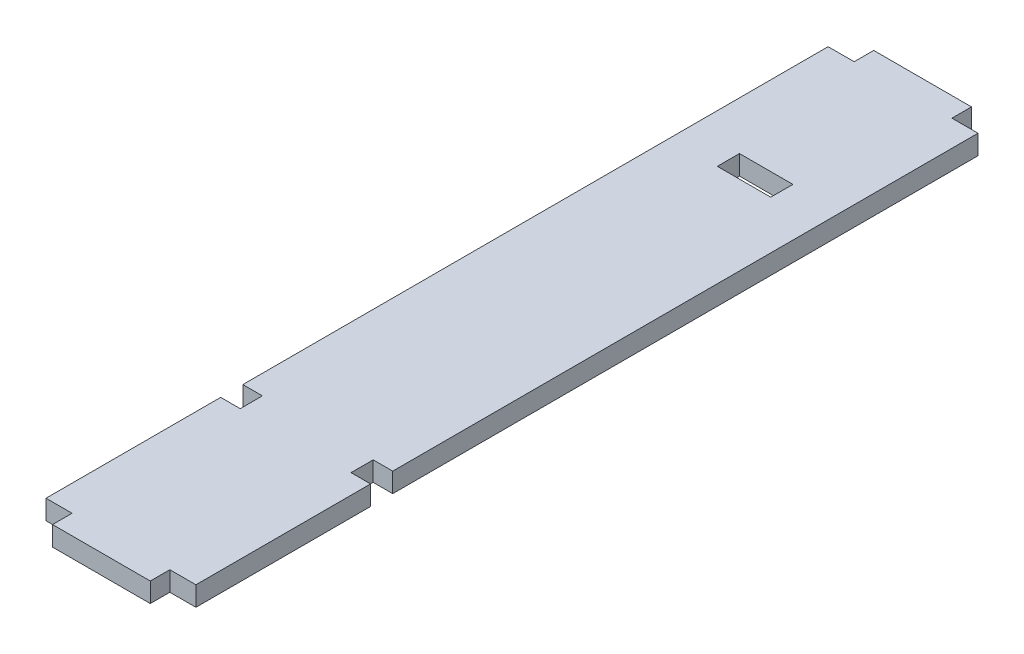
ISO-10303-21;
HEADER;
FILE_DESCRIPTION(('STEP AP214'),'2;1');
FILE_NAME('part.step','',(''),(''),'','','');
FILE_SCHEMA(('AUTOMOTIVE_DESIGN { 1 0 10303 214 1 1 1 1 }'));
ENDSEC;
DATA;
#1=APPLICATION_CONTEXT('core data for automotive mechanical design processes');
#2=APPLICATION_PROTOCOL_DEFINITION('international standard','automotive_design',2000,#1);
#3=PRODUCT_CONTEXT('',#1,'mechanical');
#4=PRODUCT('Part','Part','',(#3));
#5=PRODUCT_RELATED_PRODUCT_CATEGORY('part','',(#4));
#6=PRODUCT_DEFINITION_FORMATION('','',#4);
#7=PRODUCT_DEFINITION_CONTEXT('part definition',#1,'design');
#8=PRODUCT_DEFINITION('design','',#6,#7);
#9=PRODUCT_DEFINITION_SHAPE('','',#8);
#10=(LENGTH_UNIT() NAMED_UNIT(*) SI_UNIT(.MILLI.,.METRE.));
#11=(NAMED_UNIT(*) PLANE_ANGLE_UNIT() SI_UNIT($,.RADIAN.));
#12=(NAMED_UNIT(*) SI_UNIT($,.STERADIAN.) SOLID_ANGLE_UNIT());
#13=UNCERTAINTY_MEASURE_WITH_UNIT(LENGTH_MEASURE(1.E-05),#10,'distance_accuracy_value','');
#14=(GEOMETRIC_REPRESENTATION_CONTEXT(3) GLOBAL_UNCERTAINTY_ASSIGNED_CONTEXT((#13)) GLOBAL_UNIT_ASSIGNED_CONTEXT((#10,
#11,#12)) REPRESENTATION_CONTEXT('',''));
#15=CARTESIAN_POINT('',(0.,0.,0.));
#16=DIRECTION('',(0.,0.,1.));
#17=DIRECTION('',(1.,0.,0.));
#18=AXIS2_PLACEMENT_3D('',#15,#16,#17);
#19=CARTESIAN_POINT('',(0.,1.5,0.));
#20=DIRECTION('',(0.,-1.,0.));
#21=DIRECTION('',(0.,0.,-1.));
#22=AXIS2_PLACEMENT_3D('',#19,#20,#21);
#23=PLANE('',#22);
#24=DIRECTION('',(0.,0.,-1.));
#25=VECTOR('',#24,1.);
#26=CARTESIAN_POINT('',(5.75,1.5,14.9000000000339));
#27=LINE('',#26,#25);
#28=CARTESIAN_POINT('',(5.75,1.5,14.9000000000339));
#29=VERTEX_POINT('',#28);
#30=CARTESIAN_POINT('',(5.75,1.5,-30.));
#31=VERTEX_POINT('',#30);
#32=EDGE_CURVE('E230',#29,#31,#27,.T.);
#33=ORIENTED_EDGE('',*,*,#32,.T.);
#34=DIRECTION('',(-1.,0.,0.));
#35=VECTOR('',#34,1.);
#36=CARTESIAN_POINT('',(3.75,1.5,-30.));
#37=LINE('',#36,#35);
#38=CARTESIAN_POINT('',(3.75,1.5,-30.));
#39=VERTEX_POINT('',#38);
#40=EDGE_CURVE('E233',#31,#39,#37,.T.);
#41=ORIENTED_EDGE('',*,*,#40,.T.);
#42=DIRECTION('',(0.,0.,-1.));
#43=VECTOR('',#42,1.);
#44=CARTESIAN_POINT('',(3.75,1.5,-30.));
#45=LINE('',#44,#43);
#46=CARTESIAN_POINT('',(3.75,1.5,-31.5));
#47=VERTEX_POINT('',#46);
#48=EDGE_CURVE('E236',#39,#47,#45,.T.);
#49=ORIENTED_EDGE('',*,*,#48,.T.);
#50=DIRECTION('',(-1.,0.,0.));
#51=VECTOR('',#50,1.);
#52=CARTESIAN_POINT('',(3.75,1.5,-31.5));
#53=LINE('',#52,#51);
#54=CARTESIAN_POINT('',(-3.75,1.5,-31.5));
#55=VERTEX_POINT('',#54);
#56=EDGE_CURVE('E238',#47,#55,#53,.T.);
#57=ORIENTED_EDGE('',*,*,#56,.T.);
#58=DIRECTION('',(0.,0.,1.));
#59=VECTOR('',#58,1.);
#60=CARTESIAN_POINT('',(-3.75,1.5,-30.));
#61=LINE('',#60,#59);
#62=CARTESIAN_POINT('',(-3.75,1.5,-30.));
#63=VERTEX_POINT('',#62);
#64=EDGE_CURVE('E240',#55,#63,#61,.T.);
#65=ORIENTED_EDGE('',*,*,#64,.T.);
#66=DIRECTION('',(-1.,0.,0.));
#67=VECTOR('',#66,1.);
#68=CARTESIAN_POINT('',(-5.75,1.5,-30.));
#69=LINE('',#68,#67);
#70=CARTESIAN_POINT('',(-5.75,1.5,-30.));
#71=VERTEX_POINT('',#70);
#72=EDGE_CURVE('E242',#63,#71,#69,.T.);
#73=ORIENTED_EDGE('',*,*,#72,.T.);
#74=DIRECTION('',(0.,0.,1.));
#75=VECTOR('',#74,1.);
#76=CARTESIAN_POINT('',(-5.75,1.5,14.9000000000339));
#77=LINE('',#76,#75);
#78=CARTESIAN_POINT('',(-5.75,1.5,14.9000000000339));
#79=VERTEX_POINT('',#78);
#80=EDGE_CURVE('E244',#71,#79,#77,.T.);
#81=ORIENTED_EDGE('',*,*,#80,.T.);
#82=DIRECTION('',(1.,0.,0.));
#83=VECTOR('',#82,1.);
#84=CARTESIAN_POINT('',(-5.75,1.5,14.9000000000339));
#85=LINE('',#84,#83);
#86=CARTESIAN_POINT('',(-4.25,1.5,14.9000000000339));
#87=VERTEX_POINT('',#86);
#88=EDGE_CURVE('E246',#79,#87,#85,.T.);
#89=ORIENTED_EDGE('',*,*,#88,.T.);
#90=DIRECTION('',(0.,0.,1.));
#91=VECTOR('',#90,1.);
#92=CARTESIAN_POINT('',(-4.25,1.5,14.9000000000339));
#93=LINE('',#92,#91);
#94=CARTESIAN_POINT('',(-4.25,1.5,16.6000000000343));
#95=VERTEX_POINT('',#94);
#96=EDGE_CURVE('E248',#87,#95,#93,.T.);
#97=ORIENTED_EDGE('',*,*,#96,.T.);
#98=DIRECTION('',(-1.,0.,0.));
#99=VECTOR('',#98,1.);
#100=CARTESIAN_POINT('',(-5.75,1.5,16.6000000000343));
#101=LINE('',#100,#99);
#102=CARTESIAN_POINT('',(-5.75,1.5,16.6000000000343));
#103=VERTEX_POINT('',#102);
#104=EDGE_CURVE('E250',#95,#103,#101,.T.);
#105=ORIENTED_EDGE('',*,*,#104,.T.);
#106=DIRECTION('',(0.,0.,1.));
#107=VECTOR('',#106,1.);
#108=CARTESIAN_POINT('',(-5.75,1.5,30.));
#109=LINE('',#108,#107);
#110=CARTESIAN_POINT('',(-5.75,1.5,30.));
#111=VERTEX_POINT('',#110);
#112=EDGE_CURVE('E252',#103,#111,#109,.T.);
#113=ORIENTED_EDGE('',*,*,#112,.T.);
#114=DIRECTION('',(1.,0.,0.));
#115=VECTOR('',#114,1.);
#116=CARTESIAN_POINT('',(-5.75,1.5,30.));
#117=LINE('',#116,#115);
#118=CARTESIAN_POINT('',(-3.75,1.5,30.));
#119=VERTEX_POINT('',#118);
#120=EDGE_CURVE('E254',#111,#119,#117,.T.);
#121=ORIENTED_EDGE('',*,*,#120,.T.);
#122=DIRECTION('',(0.,0.,1.));
#123=VECTOR('',#122,1.);
#124=CARTESIAN_POINT('',(-3.75,1.5,30.));
#125=LINE('',#124,#123);
#126=CARTESIAN_POINT('',(-3.75,1.5,31.5));
#127=VERTEX_POINT('',#126);
#128=EDGE_CURVE('E256',#119,#127,#125,.T.);
#129=ORIENTED_EDGE('',*,*,#128,.T.);
#130=DIRECTION('',(1.,0.,0.));
#131=VECTOR('',#130,1.);
#132=CARTESIAN_POINT('',(-3.75,1.5,31.5));
#133=LINE('',#132,#131);
#134=CARTESIAN_POINT('',(3.75,1.5,31.5));
#135=VERTEX_POINT('',#134);
#136=EDGE_CURVE('E258',#127,#135,#133,.T.);
#137=ORIENTED_EDGE('',*,*,#136,.T.);
#138=DIRECTION('',(0.,0.,-1.));
#139=VECTOR('',#138,1.);
#140=CARTESIAN_POINT('',(3.75,1.5,30.));
#141=LINE('',#140,#139);
#142=CARTESIAN_POINT('',(3.75,1.5,30.));
#143=VERTEX_POINT('',#142);
#144=EDGE_CURVE('E260',#135,#143,#141,.T.);
#145=ORIENTED_EDGE('',*,*,#144,.T.);
#146=DIRECTION('',(1.,0.,0.));
#147=VECTOR('',#146,1.);
#148=CARTESIAN_POINT('',(3.75,1.5,30.));
#149=LINE('',#148,#147);
#150=CARTESIAN_POINT('',(5.75,1.5,30.));
#151=VERTEX_POINT('',#150);
#152=EDGE_CURVE('E262',#143,#151,#149,.T.);
#153=ORIENTED_EDGE('',*,*,#152,.T.);
#154=DIRECTION('',(0.,0.,-1.));
#155=VECTOR('',#154,1.);
#156=CARTESIAN_POINT('',(5.75,1.5,30.));
#157=LINE('',#156,#155);
#158=CARTESIAN_POINT('',(5.75,1.5,16.6000000000343));
#159=VERTEX_POINT('',#158);
#160=EDGE_CURVE('E264',#151,#159,#157,.T.);
#161=ORIENTED_EDGE('',*,*,#160,.T.);
#162=DIRECTION('',(-1.,0.,0.));
#163=VECTOR('',#162,1.);
#164=CARTESIAN_POINT('',(5.75,1.5,16.6000000000343));
#165=LINE('',#164,#163);
#166=CARTESIAN_POINT('',(4.25,1.5,16.6000000000343));
#167=VERTEX_POINT('',#166);
#168=EDGE_CURVE('E266',#159,#167,#165,.T.);
#169=ORIENTED_EDGE('',*,*,#168,.T.);
#170=DIRECTION('',(0.,0.,-1.));
#171=VECTOR('',#170,1.);
#172=CARTESIAN_POINT('',(4.25,1.5,16.6000000000343));
#173=LINE('',#172,#171);
#174=CARTESIAN_POINT('',(4.25,1.5,14.9000000000339));
#175=VERTEX_POINT('',#174);
#176=EDGE_CURVE('E268',#167,#175,#173,.T.);
#177=ORIENTED_EDGE('',*,*,#176,.T.);
#178=DIRECTION('',(1.,0.,0.));
#179=VECTOR('',#178,1.);
#180=CARTESIAN_POINT('',(5.75,1.5,14.9000000000339));
#181=LINE('',#180,#179);
#182=EDGE_CURVE('E270',#175,#29,#181,.T.);
#183=ORIENTED_EDGE('',*,*,#182,.T.);
#184=EDGE_LOOP('',(#33,#41,#49,#57,#65,#73,#81,#89,#97,#105,#113,#121,#129,#137,#145,#153,#161,
#169,#177,#183));
#185=FACE_BOUND('',#184,.T.);
#186=DIRECTION('',(0.,0.,-1.));
#187=VECTOR('',#186,1.);
#188=CARTESIAN_POINT('',(2.05,1.5,-17.8));
#189=LINE('',#188,#187);
#190=CARTESIAN_POINT('',(2.05,1.5,-17.8));
#191=VERTEX_POINT('',#190);
#192=CARTESIAN_POINT('',(2.05,1.5,-19.5));
#193=VERTEX_POINT('',#192);
#194=EDGE_CURVE('E194',#191,#193,#189,.T.);
#195=ORIENTED_EDGE('',*,*,#194,.F.);
#196=DIRECTION('',(1.,0.,0.));
#197=VECTOR('',#196,1.);
#198=CARTESIAN_POINT('',(-2.05,1.5,-17.8));
#199=LINE('',#198,#197);
#200=CARTESIAN_POINT('',(-2.05,1.5,-17.8));
#201=VERTEX_POINT('',#200);
#202=EDGE_CURVE('E216',#201,#191,#199,.T.);
#203=ORIENTED_EDGE('',*,*,#202,.F.);
#204=DIRECTION('',(0.,0.,1.));
#205=VECTOR('',#204,1.);
#206=CARTESIAN_POINT('',(-2.05,1.5,-17.8));
#207=LINE('',#206,#205);
#208=CARTESIAN_POINT('',(-2.05,1.5,-19.5));
#209=VERTEX_POINT('',#208);
#210=EDGE_CURVE('E214',#209,#201,#207,.T.);
#211=ORIENTED_EDGE('',*,*,#210,.F.);
#212=DIRECTION('',(-1.,0.,0.));
#213=VECTOR('',#212,1.);
#214=CARTESIAN_POINT('',(-2.05,1.5,-19.5));
#215=LINE('',#214,#213);
#216=EDGE_CURVE('E202',#193,#209,#215,.T.);
#217=ORIENTED_EDGE('',*,*,#216,.F.);
#218=EDGE_LOOP('',(#195,#203,#211,#217));
#219=FACE_BOUND('',#218,.T.);
#220=ADVANCED_FACE('F33',(#185,#219),#23,.F.);
#221=CARTESIAN_POINT('',(0.,0.,0.));
#222=DIRECTION('',(0.,-1.,0.));
#223=DIRECTION('',(0.,0.,-1.));
#224=AXIS2_PLACEMENT_3D('',#221,#222,#223);
#225=PLANE('',#224);
#226=DIRECTION('',(0.,0.,-1.));
#227=VECTOR('',#226,1.);
#228=CARTESIAN_POINT('',(5.75,0.,14.9000000000339));
#229=LINE('',#228,#227);
#230=CARTESIAN_POINT('',(5.75,0.,14.9000000000339));
#231=VERTEX_POINT('',#230);
#232=CARTESIAN_POINT('',(5.75,0.,-30.));
#233=VERTEX_POINT('',#232);
#234=EDGE_CURVE('E210',#231,#233,#229,.T.);
#235=ORIENTED_EDGE('',*,*,#234,.F.);
#236=DIRECTION('',(1.,0.,0.));
#237=VECTOR('',#236,1.);
#238=CARTESIAN_POINT('',(5.75,0.,14.9000000000339));
#239=LINE('',#238,#237);
#240=CARTESIAN_POINT('',(4.25,0.,14.9000000000339));
#241=VERTEX_POINT('',#240);
#242=EDGE_CURVE('E234',#241,#231,#239,.T.);
#243=ORIENTED_EDGE('',*,*,#242,.F.);
#244=DIRECTION('',(0.,0.,-1.));
#245=VECTOR('',#244,1.);
#246=CARTESIAN_POINT('',(4.25,0.,16.6000000000343));
#247=LINE('',#246,#245);
#248=CARTESIAN_POINT('',(4.25,0.,16.6000000000343));
#249=VERTEX_POINT('',#248);
#250=EDGE_CURVE('E309',#249,#241,#247,.T.);
#251=ORIENTED_EDGE('',*,*,#250,.F.);
#252=DIRECTION('',(-1.,0.,0.));
#253=VECTOR('',#252,1.);
#254=CARTESIAN_POINT('',(5.75,0.,16.6000000000343));
#255=LINE('',#254,#253);
#256=CARTESIAN_POINT('',(5.75,0.,16.6000000000343));
#257=VERTEX_POINT('',#256);
#258=EDGE_CURVE('E307',#257,#249,#255,.T.);
#259=ORIENTED_EDGE('',*,*,#258,.F.);
#260=DIRECTION('',(0.,0.,-1.));
#261=VECTOR('',#260,1.);
#262=CARTESIAN_POINT('',(5.75,0.,30.));
#263=LINE('',#262,#261);
#264=CARTESIAN_POINT('',(5.75,0.,30.));
#265=VERTEX_POINT('',#264);
#266=EDGE_CURVE('E305',#265,#257,#263,.T.);
#267=ORIENTED_EDGE('',*,*,#266,.F.);
#268=DIRECTION('',(1.,0.,0.));
#269=VECTOR('',#268,1.);
#270=CARTESIAN_POINT('',(3.75,0.,30.));
#271=LINE('',#270,#269);
#272=CARTESIAN_POINT('',(3.75,0.,30.));
#273=VERTEX_POINT('',#272);
#274=EDGE_CURVE('E303',#273,#265,#271,.T.);
#275=ORIENTED_EDGE('',*,*,#274,.F.);
#276=DIRECTION('',(0.,0.,-1.));
#277=VECTOR('',#276,1.);
#278=CARTESIAN_POINT('',(3.75,0.,30.));
#279=LINE('',#278,#277);
#280=CARTESIAN_POINT('',(3.75,0.,31.5));
#281=VERTEX_POINT('',#280);
#282=EDGE_CURVE('E301',#281,#273,#279,.T.);
#283=ORIENTED_EDGE('',*,*,#282,.F.);
#284=DIRECTION('',(1.,0.,0.));
#285=VECTOR('',#284,1.);
#286=CARTESIAN_POINT('',(-3.75,0.,31.5));
#287=LINE('',#286,#285);
#288=CARTESIAN_POINT('',(-3.75,0.,31.5));
#289=VERTEX_POINT('',#288);
#290=EDGE_CURVE('E299',#289,#281,#287,.T.);
#291=ORIENTED_EDGE('',*,*,#290,.F.);
#292=DIRECTION('',(0.,0.,1.));
#293=VECTOR('',#292,1.);
#294=CARTESIAN_POINT('',(-3.75,0.,30.));
#295=LINE('',#294,#293);
#296=CARTESIAN_POINT('',(-3.75,0.,30.));
#297=VERTEX_POINT('',#296);
#298=EDGE_CURVE('E297',#297,#289,#295,.T.);
#299=ORIENTED_EDGE('',*,*,#298,.F.);
#300=DIRECTION('',(1.,0.,0.));
#301=VECTOR('',#300,1.);
#302=CARTESIAN_POINT('',(-5.75,0.,30.));
#303=LINE('',#302,#301);
#304=CARTESIAN_POINT('',(-5.75,0.,30.));
#305=VERTEX_POINT('',#304);
#306=EDGE_CURVE('E295',#305,#297,#303,.T.);
#307=ORIENTED_EDGE('',*,*,#306,.F.);
#308=DIRECTION('',(0.,0.,1.));
#309=VECTOR('',#308,1.);
#310=CARTESIAN_POINT('',(-5.75,0.,30.));
#311=LINE('',#310,#309);
#312=CARTESIAN_POINT('',(-5.75,0.,16.6000000000343));
#313=VERTEX_POINT('',#312);
#314=EDGE_CURVE('E293',#313,#305,#311,.T.);
#315=ORIENTED_EDGE('',*,*,#314,.F.);
#316=DIRECTION('',(-1.,0.,0.));
#317=VECTOR('',#316,1.);
#318=CARTESIAN_POINT('',(-5.75,0.,16.6000000000343));
#319=LINE('',#318,#317);
#320=CARTESIAN_POINT('',(-4.25,0.,16.6000000000343));
#321=VERTEX_POINT('',#320);
#322=EDGE_CURVE('E291',#321,#313,#319,.T.);
#323=ORIENTED_EDGE('',*,*,#322,.F.);
#324=DIRECTION('',(0.,0.,1.));
#325=VECTOR('',#324,1.);
#326=CARTESIAN_POINT('',(-4.25,0.,14.9000000000339));
#327=LINE('',#326,#325);
#328=CARTESIAN_POINT('',(-4.25,0.,14.9000000000339));
#329=VERTEX_POINT('',#328);
#330=EDGE_CURVE('E289',#329,#321,#327,.T.);
#331=ORIENTED_EDGE('',*,*,#330,.F.);
#332=DIRECTION('',(1.,0.,0.));
#333=VECTOR('',#332,1.);
#334=CARTESIAN_POINT('',(-5.75,0.,14.9000000000339));
#335=LINE('',#334,#333);
#336=CARTESIAN_POINT('',(-5.75,0.,14.9000000000339));
#337=VERTEX_POINT('',#336);
#338=EDGE_CURVE('E287',#337,#329,#335,.T.);
#339=ORIENTED_EDGE('',*,*,#338,.F.);
#340=DIRECTION('',(0.,0.,1.));
#341=VECTOR('',#340,1.);
#342=CARTESIAN_POINT('',(-5.75,0.,14.9000000000339));
#343=LINE('',#342,#341);
#344=CARTESIAN_POINT('',(-5.75,0.,-30.));
#345=VERTEX_POINT('',#344);
#346=EDGE_CURVE('E285',#345,#337,#343,.T.);
#347=ORIENTED_EDGE('',*,*,#346,.F.);
#348=DIRECTION('',(-1.,0.,0.));
#349=VECTOR('',#348,1.);
#350=CARTESIAN_POINT('',(-5.75,0.,-30.));
#351=LINE('',#350,#349);
#352=CARTESIAN_POINT('',(-3.75,0.,-30.));
#353=VERTEX_POINT('',#352);
#354=EDGE_CURVE('E283',#353,#345,#351,.T.);
#355=ORIENTED_EDGE('',*,*,#354,.F.);
#356=DIRECTION('',(0.,0.,1.));
#357=VECTOR('',#356,1.);
#358=CARTESIAN_POINT('',(-3.75,0.,-30.));
#359=LINE('',#358,#357);
#360=CARTESIAN_POINT('',(-3.75,0.,-31.5));
#361=VERTEX_POINT('',#360);
#362=EDGE_CURVE('E281',#361,#353,#359,.T.);
#363=ORIENTED_EDGE('',*,*,#362,.F.);
#364=DIRECTION('',(-1.,0.,0.));
#365=VECTOR('',#364,1.);
#366=CARTESIAN_POINT('',(3.75,0.,-31.5));
#367=LINE('',#366,#365);
#368=CARTESIAN_POINT('',(3.75,0.,-31.5));
#369=VERTEX_POINT('',#368);
#370=EDGE_CURVE('E279',#369,#361,#367,.T.);
#371=ORIENTED_EDGE('',*,*,#370,.F.);
#372=DIRECTION('',(0.,0.,-1.));
#373=VECTOR('',#372,1.);
#374=CARTESIAN_POINT('',(3.75,0.,-30.));
#375=LINE('',#374,#373);
#376=CARTESIAN_POINT('',(3.75,0.,-30.));
#377=VERTEX_POINT('',#376);
#378=EDGE_CURVE('E277',#377,#369,#375,.T.);
#379=ORIENTED_EDGE('',*,*,#378,.F.);
#380=DIRECTION('',(-1.,0.,0.));
#381=VECTOR('',#380,1.);
#382=CARTESIAN_POINT('',(3.75,0.,-30.));
#383=LINE('',#382,#381);
#384=EDGE_CURVE('E275',#233,#377,#383,.T.);
#385=ORIENTED_EDGE('',*,*,#384,.F.);
#386=EDGE_LOOP('',(#235,#243,#251,#259,#267,#275,#283,#291,#299,#307,#315,#323,#331,#339,#347,
#355,#363,#371,#379,#385));
#387=FACE_BOUND('',#386,.T.);
#388=DIRECTION('',(1.,0.,0.));
#389=VECTOR('',#388,1.);
#390=CARTESIAN_POINT('',(-2.05,0.,-17.8));
#391=LINE('',#390,#389);
#392=CARTESIAN_POINT('',(-2.05,0.,-17.8));
#393=VERTEX_POINT('',#392);
#394=CARTESIAN_POINT('',(2.05,0.,-17.8));
#395=VERTEX_POINT('',#394);
#396=EDGE_CURVE('E203',#393,#395,#391,.T.);
#397=ORIENTED_EDGE('',*,*,#396,.T.);
#398=DIRECTION('',(0.,0.,-1.));
#399=VECTOR('',#398,1.);
#400=CARTESIAN_POINT('',(2.05,0.,-17.8));
#401=LINE('',#400,#399);
#402=CARTESIAN_POINT('',(2.05,0.,-19.5));
#403=VERTEX_POINT('',#402);
#404=EDGE_CURVE('E56',#395,#403,#401,.T.);
#405=ORIENTED_EDGE('',*,*,#404,.T.);
#406=DIRECTION('',(-1.,0.,0.));
#407=VECTOR('',#406,1.);
#408=CARTESIAN_POINT('',(-2.05,0.,-19.5));
#409=LINE('',#408,#407);
#410=CARTESIAN_POINT('',(-2.05,0.,-19.5));
#411=VERTEX_POINT('',#410);
#412=EDGE_CURVE('E209',#403,#411,#409,.T.);
#413=ORIENTED_EDGE('',*,*,#412,.T.);
#414=DIRECTION('',(0.,0.,1.));
#415=VECTOR('',#414,1.);
#416=CARTESIAN_POINT('',(-2.05,0.,-17.8));
#417=LINE('',#416,#415);
#418=EDGE_CURVE('E222',#411,#393,#417,.T.);
#419=ORIENTED_EDGE('',*,*,#418,.T.);
#420=EDGE_LOOP('',(#397,#405,#413,#419));
#421=FACE_BOUND('',#420,.T.);
#422=ADVANCED_FACE('F375',(#387,#421),#225,.T.);
#423=CARTESIAN_POINT('',(5.75,1.5,14.9000000000339));
#424=DIRECTION('',(-1.,0.,0.));
#425=DIRECTION('',(0.,0.,1.));
#426=AXIS2_PLACEMENT_3D('',#423,#424,#425);
#427=PLANE('',#426);
#428=ORIENTED_EDGE('',*,*,#234,.T.);
#429=DIRECTION('',(0.,-1.,0.));
#430=VECTOR('',#429,1.);
#431=CARTESIAN_POINT('',(5.75,1.5,-30.));
#432=LINE('',#431,#430);
#433=EDGE_CURVE('E11',#31,#233,#432,.T.);
#434=ORIENTED_EDGE('',*,*,#433,.F.);
#435=ORIENTED_EDGE('',*,*,#32,.F.);
#436=DIRECTION('',(0.,-1.,0.));
#437=VECTOR('',#436,1.);
#438=CARTESIAN_POINT('',(5.75,1.5,14.9000000000339));
#439=LINE('',#438,#437);
#440=EDGE_CURVE('E272',#29,#231,#439,.T.);
#441=ORIENTED_EDGE('',*,*,#440,.T.);
#442=EDGE_LOOP('',(#428,#434,#435,#441));
#443=FACE_BOUND('',#442,.T.);
#444=ADVANCED_FACE('F35',(#443),#427,.F.);
#445=CARTESIAN_POINT('',(3.75,1.5,-30.));
#446=DIRECTION('',(0.,0.,1.));
#447=DIRECTION('',(1.,0.,0.));
#448=AXIS2_PLACEMENT_3D('',#445,#446,#447);
#449=PLANE('',#448);
#450=ORIENTED_EDGE('',*,*,#384,.T.);
#451=DIRECTION('',(0.,-1.,0.));
#452=VECTOR('',#451,1.);
#453=CARTESIAN_POINT('',(3.75,1.5,-30.));
#454=LINE('',#453,#452);
#455=EDGE_CURVE('E41',#39,#377,#454,.T.);
#456=ORIENTED_EDGE('',*,*,#455,.F.);
#457=ORIENTED_EDGE('',*,*,#40,.F.);
#458=ORIENTED_EDGE('',*,*,#433,.T.);
#459=EDGE_LOOP('',(#450,#456,#457,#458));
#460=FACE_BOUND('',#459,.T.);
#461=ADVANCED_FACE('F392',(#460),#449,.F.);
#462=CARTESIAN_POINT('',(3.75,1.5,-30.));
#463=DIRECTION('',(-1.,0.,0.));
#464=DIRECTION('',(0.,0.,1.));
#465=AXIS2_PLACEMENT_3D('',#462,#463,#464);
#466=PLANE('',#465);
#467=ORIENTED_EDGE('',*,*,#378,.T.);
#468=DIRECTION('',(0.,-1.,0.));
#469=VECTOR('',#468,1.);
#470=CARTESIAN_POINT('',(3.75,1.5,-31.5));
#471=LINE('',#470,#469);
#472=EDGE_CURVE('E362',#47,#369,#471,.T.);
#473=ORIENTED_EDGE('',*,*,#472,.F.);
#474=ORIENTED_EDGE('',*,*,#48,.F.);
#475=ORIENTED_EDGE('',*,*,#455,.T.);
#476=EDGE_LOOP('',(#467,#473,#474,#475));
#477=FACE_BOUND('',#476,.T.);
#478=ADVANCED_FACE('F369',(#477),#466,.F.);
#479=CARTESIAN_POINT('',(3.75,1.5,-31.5));
#480=DIRECTION('',(0.,0.,1.));
#481=DIRECTION('',(1.,0.,0.));
#482=AXIS2_PLACEMENT_3D('',#479,#480,#481);
#483=PLANE('',#482);
#484=ORIENTED_EDGE('',*,*,#370,.T.);
#485=DIRECTION('',(0.,-1.,0.));
#486=VECTOR('',#485,1.);
#487=CARTESIAN_POINT('',(-3.75,1.5,-31.5));
#488=LINE('',#487,#486);
#489=EDGE_CURVE('E359',#55,#361,#488,.T.);
#490=ORIENTED_EDGE('',*,*,#489,.F.);
#491=ORIENTED_EDGE('',*,*,#56,.F.);
#492=ORIENTED_EDGE('',*,*,#472,.T.);
#493=EDGE_LOOP('',(#484,#490,#491,#492));
#494=FACE_BOUND('',#493,.T.);
#495=ADVANCED_FACE('F381',(#494),#483,.F.);
#496=CARTESIAN_POINT('',(-3.75,1.5,-30.));
#497=DIRECTION('',(1.,0.,0.));
#498=DIRECTION('',(0.,0.,-1.));
#499=AXIS2_PLACEMENT_3D('',#496,#497,#498);
#500=PLANE('',#499);
#501=ORIENTED_EDGE('',*,*,#362,.T.);
#502=DIRECTION('',(0.,-1.,0.));
#503=VECTOR('',#502,1.);
#504=CARTESIAN_POINT('',(-3.75,1.5,-30.));
#505=LINE('',#504,#503);
#506=EDGE_CURVE('E356',#63,#353,#505,.T.);
#507=ORIENTED_EDGE('',*,*,#506,.F.);
#508=ORIENTED_EDGE('',*,*,#64,.F.);
#509=ORIENTED_EDGE('',*,*,#489,.T.);
#510=EDGE_LOOP('',(#501,#507,#508,#509));
#511=FACE_BOUND('',#510,.T.);
#512=ADVANCED_FACE('F385',(#511),#500,.F.);
#513=CARTESIAN_POINT('',(-5.75,1.5,-30.));
#514=DIRECTION('',(0.,0.,1.));
#515=DIRECTION('',(1.,0.,0.));
#516=AXIS2_PLACEMENT_3D('',#513,#514,#515);
#517=PLANE('',#516);
#518=ORIENTED_EDGE('',*,*,#354,.T.);
#519=DIRECTION('',(0.,-1.,0.));
#520=VECTOR('',#519,1.);
#521=CARTESIAN_POINT('',(-5.75,1.5,-30.));
#522=LINE('',#521,#520);
#523=EDGE_CURVE('E353',#71,#345,#522,.T.);
#524=ORIENTED_EDGE('',*,*,#523,.F.);
#525=ORIENTED_EDGE('',*,*,#72,.F.);
#526=ORIENTED_EDGE('',*,*,#506,.T.);
#527=EDGE_LOOP('',(#518,#524,#525,#526));
#528=FACE_BOUND('',#527,.T.);
#529=ADVANCED_FACE('F465',(#528),#517,.F.);
#530=CARTESIAN_POINT('',(-5.75,1.5,14.9000000000339));
#531=DIRECTION('',(1.,0.,0.));
#532=DIRECTION('',(0.,0.,-1.));
#533=AXIS2_PLACEMENT_3D('',#530,#531,#532);
#534=PLANE('',#533);
#535=ORIENTED_EDGE('',*,*,#346,.T.);
#536=DIRECTION('',(0.,-1.,0.));
#537=VECTOR('',#536,1.);
#538=CARTESIAN_POINT('',(-5.75,1.5,14.9000000000339));
#539=LINE('',#538,#537);
#540=EDGE_CURVE('E350',#79,#337,#539,.T.);
#541=ORIENTED_EDGE('',*,*,#540,.F.);
#542=ORIENTED_EDGE('',*,*,#80,.F.);
#543=ORIENTED_EDGE('',*,*,#523,.T.);
#544=EDGE_LOOP('',(#535,#541,#542,#543));
#545=FACE_BOUND('',#544,.T.);
#546=ADVANCED_FACE('F463',(#545),#534,.F.);
#547=CARTESIAN_POINT('',(-5.75,1.5,14.9000000000339));
#548=DIRECTION('',(0.,0.,-1.));
#549=DIRECTION('',(-1.,0.,0.));
#550=AXIS2_PLACEMENT_3D('',#547,#548,#549);
#551=PLANE('',#550);
#552=ORIENTED_EDGE('',*,*,#338,.T.);
#553=DIRECTION('',(0.,-1.,0.));
#554=VECTOR('',#553,1.);
#555=CARTESIAN_POINT('',(-4.25,1.5,14.9000000000339));
#556=LINE('',#555,#554);
#557=EDGE_CURVE('E347',#87,#329,#556,.T.);
#558=ORIENTED_EDGE('',*,*,#557,.F.);
#559=ORIENTED_EDGE('',*,*,#88,.F.);
#560=ORIENTED_EDGE('',*,*,#540,.T.);
#561=EDGE_LOOP('',(#552,#558,#559,#560));
#562=FACE_BOUND('',#561,.T.);
#563=ADVANCED_FACE('F458',(#562),#551,.F.);
#564=CARTESIAN_POINT('',(-4.25,1.5,14.9000000000339));
#565=DIRECTION('',(1.,0.,0.));
#566=DIRECTION('',(0.,0.,-1.));
#567=AXIS2_PLACEMENT_3D('',#564,#565,#566);
#568=PLANE('',#567);
#569=ORIENTED_EDGE('',*,*,#330,.T.);
#570=DIRECTION('',(0.,-1.,0.));
#571=VECTOR('',#570,1.);
#572=CARTESIAN_POINT('',(-4.25,1.5,16.6000000000343));
#573=LINE('',#572,#571);
#574=EDGE_CURVE('E344',#95,#321,#573,.T.);
#575=ORIENTED_EDGE('',*,*,#574,.F.);
#576=ORIENTED_EDGE('',*,*,#96,.F.);
#577=ORIENTED_EDGE('',*,*,#557,.T.);
#578=EDGE_LOOP('',(#569,#575,#576,#577));
#579=FACE_BOUND('',#578,.T.);
#580=ADVANCED_FACE('F453',(#579),#568,.F.);
#581=CARTESIAN_POINT('',(-5.75,1.5,16.6000000000343));
#582=DIRECTION('',(0.,0.,1.));
#583=DIRECTION('',(1.,0.,0.));
#584=AXIS2_PLACEMENT_3D('',#581,#582,#583);
#585=PLANE('',#584);
#586=ORIENTED_EDGE('',*,*,#322,.T.);
#587=DIRECTION('',(0.,-1.,0.));
#588=VECTOR('',#587,1.);
#589=CARTESIAN_POINT('',(-5.75,1.5,16.6000000000343));
#590=LINE('',#589,#588);
#591=EDGE_CURVE('E341',#103,#313,#590,.T.);
#592=ORIENTED_EDGE('',*,*,#591,.F.);
#593=ORIENTED_EDGE('',*,*,#104,.F.);
#594=ORIENTED_EDGE('',*,*,#574,.T.);
#595=EDGE_LOOP('',(#586,#592,#593,#594));
#596=FACE_BOUND('',#595,.T.);
#597=ADVANCED_FACE('F449',(#596),#585,.F.);
#598=CARTESIAN_POINT('',(-5.75,1.5,30.));
#599=DIRECTION('',(1.,0.,0.));
#600=DIRECTION('',(0.,0.,-1.));
#601=AXIS2_PLACEMENT_3D('',#598,#599,#600);
#602=PLANE('',#601);
#603=ORIENTED_EDGE('',*,*,#314,.T.);
#604=DIRECTION('',(0.,-1.,0.));
#605=VECTOR('',#604,1.);
#606=CARTESIAN_POINT('',(-5.75,1.5,30.));
#607=LINE('',#606,#605);
#608=EDGE_CURVE('E338',#111,#305,#607,.T.);
#609=ORIENTED_EDGE('',*,*,#608,.F.);
#610=ORIENTED_EDGE('',*,*,#112,.F.);
#611=ORIENTED_EDGE('',*,*,#591,.T.);
#612=EDGE_LOOP('',(#603,#609,#610,#611));
#613=FACE_BOUND('',#612,.T.);
#614=ADVANCED_FACE('F444',(#613),#602,.F.);
#615=CARTESIAN_POINT('',(-5.75,1.5,30.));
#616=DIRECTION('',(0.,0.,-1.));
#617=DIRECTION('',(-1.,0.,0.));
#618=AXIS2_PLACEMENT_3D('',#615,#616,#617);
#619=PLANE('',#618);
#620=ORIENTED_EDGE('',*,*,#306,.T.);
#621=DIRECTION('',(0.,-1.,0.));
#622=VECTOR('',#621,1.);
#623=CARTESIAN_POINT('',(-3.75,1.5,30.));
#624=LINE('',#623,#622);
#625=EDGE_CURVE('E335',#119,#297,#624,.T.);
#626=ORIENTED_EDGE('',*,*,#625,.F.);
#627=ORIENTED_EDGE('',*,*,#120,.F.);
#628=ORIENTED_EDGE('',*,*,#608,.T.);
#629=EDGE_LOOP('',(#620,#626,#627,#628));
#630=FACE_BOUND('',#629,.T.);
#631=ADVANCED_FACE('F438',(#630),#619,.F.);
#632=CARTESIAN_POINT('',(-3.75,1.5,30.));
#633=DIRECTION('',(1.,0.,0.));
#634=DIRECTION('',(0.,0.,-1.));
#635=AXIS2_PLACEMENT_3D('',#632,#633,#634);
#636=PLANE('',#635);
#637=ORIENTED_EDGE('',*,*,#298,.T.);
#638=DIRECTION('',(0.,-1.,0.));
#639=VECTOR('',#638,1.);
#640=CARTESIAN_POINT('',(-3.75,1.5,31.5));
#641=LINE('',#640,#639);
#642=EDGE_CURVE('E332',#127,#289,#641,.T.);
#643=ORIENTED_EDGE('',*,*,#642,.F.);
#644=ORIENTED_EDGE('',*,*,#128,.F.);
#645=ORIENTED_EDGE('',*,*,#625,.T.);
#646=EDGE_LOOP('',(#637,#643,#644,#645));
#647=FACE_BOUND('',#646,.T.);
#648=ADVANCED_FACE('F434',(#647),#636,.F.);
#649=CARTESIAN_POINT('',(-3.75,1.5,31.5));
#650=DIRECTION('',(0.,0.,-1.));
#651=DIRECTION('',(-1.,0.,0.));
#652=AXIS2_PLACEMENT_3D('',#649,#650,#651);
#653=PLANE('',#652);
#654=ORIENTED_EDGE('',*,*,#290,.T.);
#655=DIRECTION('',(0.,-1.,0.));
#656=VECTOR('',#655,1.);
#657=CARTESIAN_POINT('',(3.75,1.5,31.5));
#658=LINE('',#657,#656);
#659=EDGE_CURVE('E329',#135,#281,#658,.T.);
#660=ORIENTED_EDGE('',*,*,#659,.F.);
#661=ORIENTED_EDGE('',*,*,#136,.F.);
#662=ORIENTED_EDGE('',*,*,#642,.T.);
#663=EDGE_LOOP('',(#654,#660,#661,#662));
#664=FACE_BOUND('',#663,.T.);
#665=ADVANCED_FACE('F429',(#664),#653,.F.);
#666=CARTESIAN_POINT('',(3.75,1.5,30.));
#667=DIRECTION('',(-1.,0.,0.));
#668=DIRECTION('',(0.,0.,1.));
#669=AXIS2_PLACEMENT_3D('',#666,#667,#668);
#670=PLANE('',#669);
#671=ORIENTED_EDGE('',*,*,#282,.T.);
#672=DIRECTION('',(0.,-1.,0.));
#673=VECTOR('',#672,1.);
#674=CARTESIAN_POINT('',(3.75,1.5,30.));
#675=LINE('',#674,#673);
#676=EDGE_CURVE('E326',#143,#273,#675,.T.);
#677=ORIENTED_EDGE('',*,*,#676,.F.);
#678=ORIENTED_EDGE('',*,*,#144,.F.);
#679=ORIENTED_EDGE('',*,*,#659,.T.);
#680=EDGE_LOOP('',(#671,#677,#678,#679));
#681=FACE_BOUND('',#680,.T.);
#682=ADVANCED_FACE('F423',(#681),#670,.F.);
#683=CARTESIAN_POINT('',(3.75,1.5,30.));
#684=DIRECTION('',(0.,0.,-1.));
#685=DIRECTION('',(-1.,0.,0.));
#686=AXIS2_PLACEMENT_3D('',#683,#684,#685);
#687=PLANE('',#686);
#688=ORIENTED_EDGE('',*,*,#274,.T.);
#689=DIRECTION('',(0.,-1.,0.));
#690=VECTOR('',#689,1.);
#691=CARTESIAN_POINT('',(5.75,1.5,30.));
#692=LINE('',#691,#690);
#693=EDGE_CURVE('E323',#151,#265,#692,.T.);
#694=ORIENTED_EDGE('',*,*,#693,.F.);
#695=ORIENTED_EDGE('',*,*,#152,.F.);
#696=ORIENTED_EDGE('',*,*,#676,.T.);
#697=EDGE_LOOP('',(#688,#694,#695,#696));
#698=FACE_BOUND('',#697,.T.);
#699=ADVANCED_FACE('F419',(#698),#687,.F.);
#700=CARTESIAN_POINT('',(5.75,1.5,30.));
#701=DIRECTION('',(-1.,0.,0.));
#702=DIRECTION('',(0.,0.,1.));
#703=AXIS2_PLACEMENT_3D('',#700,#701,#702);
#704=PLANE('',#703);
#705=ORIENTED_EDGE('',*,*,#266,.T.);
#706=DIRECTION('',(0.,-1.,0.));
#707=VECTOR('',#706,1.);
#708=CARTESIAN_POINT('',(5.75,1.5,16.6000000000343));
#709=LINE('',#708,#707);
#710=EDGE_CURVE('E320',#159,#257,#709,.T.);
#711=ORIENTED_EDGE('',*,*,#710,.F.);
#712=ORIENTED_EDGE('',*,*,#160,.F.);
#713=ORIENTED_EDGE('',*,*,#693,.T.);
#714=EDGE_LOOP('',(#705,#711,#712,#713));
#715=FACE_BOUND('',#714,.T.);
#716=ADVANCED_FACE('F414',(#715),#704,.F.);
#717=CARTESIAN_POINT('',(5.75,1.5,16.6000000000343));
#718=DIRECTION('',(0.,0.,1.));
#719=DIRECTION('',(1.,0.,0.));
#720=AXIS2_PLACEMENT_3D('',#717,#718,#719);
#721=PLANE('',#720);
#722=ORIENTED_EDGE('',*,*,#258,.T.);
#723=DIRECTION('',(0.,-1.,0.));
#724=VECTOR('',#723,1.);
#725=CARTESIAN_POINT('',(4.25,1.5,16.6000000000343));
#726=LINE('',#725,#724);
#727=EDGE_CURVE('E317',#167,#249,#726,.T.);
#728=ORIENTED_EDGE('',*,*,#727,.F.);
#729=ORIENTED_EDGE('',*,*,#168,.F.);
#730=ORIENTED_EDGE('',*,*,#710,.T.);
#731=EDGE_LOOP('',(#722,#728,#729,#730));
#732=FACE_BOUND('',#731,.T.);
#733=ADVANCED_FACE('F408',(#732),#721,.F.);
#734=CARTESIAN_POINT('',(4.25,1.5,16.6000000000343));
#735=DIRECTION('',(-1.,0.,0.));
#736=DIRECTION('',(0.,0.,1.));
#737=AXIS2_PLACEMENT_3D('',#734,#735,#736);
#738=PLANE('',#737);
#739=ORIENTED_EDGE('',*,*,#250,.T.);
#740=DIRECTION('',(0.,-1.,0.));
#741=VECTOR('',#740,1.);
#742=CARTESIAN_POINT('',(4.25,1.5,14.9000000000339));
#743=LINE('',#742,#741);
#744=EDGE_CURVE('E314',#175,#241,#743,.T.);
#745=ORIENTED_EDGE('',*,*,#744,.F.);
#746=ORIENTED_EDGE('',*,*,#176,.F.);
#747=ORIENTED_EDGE('',*,*,#727,.T.);
#748=EDGE_LOOP('',(#739,#745,#746,#747));
#749=FACE_BOUND('',#748,.T.);
#750=ADVANCED_FACE('F404',(#749),#738,.F.);
#751=CARTESIAN_POINT('',(5.75,1.5,14.9000000000339));
#752=DIRECTION('',(0.,0.,-1.));
#753=DIRECTION('',(-1.,0.,0.));
#754=AXIS2_PLACEMENT_3D('',#751,#752,#753);
#755=PLANE('',#754);
#756=ORIENTED_EDGE('',*,*,#242,.T.);
#757=ORIENTED_EDGE('',*,*,#440,.F.);
#758=ORIENTED_EDGE('',*,*,#182,.F.);
#759=ORIENTED_EDGE('',*,*,#744,.T.);
#760=EDGE_LOOP('',(#756,#757,#758,#759));
#761=FACE_BOUND('',#760,.T.);
#762=ADVANCED_FACE('F399',(#761),#755,.F.);
#763=CARTESIAN_POINT('',(2.05,1.5,-17.8));
#764=DIRECTION('',(-1.,0.,0.));
#765=DIRECTION('',(0.,0.,1.));
#766=AXIS2_PLACEMENT_3D('',#763,#764,#765);
#767=PLANE('',#766);
#768=ORIENTED_EDGE('',*,*,#404,.F.);
#769=DIRECTION('',(0.,-1.,0.));
#770=VECTOR('',#769,1.);
#771=CARTESIAN_POINT('',(2.05,1.5,-17.8));
#772=LINE('',#771,#770);
#773=EDGE_CURVE('E198',#191,#395,#772,.T.);
#774=ORIENTED_EDGE('',*,*,#773,.F.);
#775=ORIENTED_EDGE('',*,*,#194,.T.);
#776=DIRECTION('',(0.,-1.,0.));
#777=VECTOR('',#776,1.);
#778=CARTESIAN_POINT('',(2.05,1.5,-19.5));
#779=LINE('',#778,#777);
#780=EDGE_CURVE('E197',#193,#403,#779,.T.);
#781=ORIENTED_EDGE('',*,*,#780,.T.);
#782=EDGE_LOOP('',(#768,#774,#775,#781));
#783=FACE_BOUND('',#782,.T.);
#784=ADVANCED_FACE('F196',(#783),#767,.T.);
#785=CARTESIAN_POINT('',(-2.05,1.5,-19.5));
#786=DIRECTION('',(0.,0.,1.));
#787=DIRECTION('',(1.,0.,0.));
#788=AXIS2_PLACEMENT_3D('',#785,#786,#787);
#789=PLANE('',#788);
#790=ORIENTED_EDGE('',*,*,#412,.F.);
#791=ORIENTED_EDGE('',*,*,#780,.F.);
#792=ORIENTED_EDGE('',*,*,#216,.T.);
#793=DIRECTION('',(0.,-1.,0.));
#794=VECTOR('',#793,1.);
#795=CARTESIAN_POINT('',(-2.05,1.5,-19.5));
#796=LINE('',#795,#794);
#797=EDGE_CURVE('E211',#209,#411,#796,.T.);
#798=ORIENTED_EDGE('',*,*,#797,.T.);
#799=EDGE_LOOP('',(#790,#791,#792,#798));
#800=FACE_BOUND('',#799,.T.);
#801=ADVANCED_FACE('F206',(#800),#789,.T.);
#802=CARTESIAN_POINT('',(-2.05,1.5,-17.8));
#803=DIRECTION('',(1.,0.,0.));
#804=DIRECTION('',(0.,0.,-1.));
#805=AXIS2_PLACEMENT_3D('',#802,#803,#804);
#806=PLANE('',#805);
#807=ORIENTED_EDGE('',*,*,#418,.F.);
#808=ORIENTED_EDGE('',*,*,#797,.F.);
#809=ORIENTED_EDGE('',*,*,#210,.T.);
#810=DIRECTION('',(0.,-1.,0.));
#811=VECTOR('',#810,1.);
#812=CARTESIAN_POINT('',(-2.05,1.5,-17.8));
#813=LINE('',#812,#811);
#814=EDGE_CURVE('E48',#201,#393,#813,.T.);
#815=ORIENTED_EDGE('',*,*,#814,.T.);
#816=EDGE_LOOP('',(#807,#808,#809,#815));
#817=FACE_BOUND('',#816,.T.);
#818=ADVANCED_FACE('F571',(#817),#806,.T.);
#819=CARTESIAN_POINT('',(-2.05,1.5,-17.8));
#820=DIRECTION('',(0.,0.,-1.));
#821=DIRECTION('',(-1.,0.,0.));
#822=AXIS2_PLACEMENT_3D('',#819,#820,#821);
#823=PLANE('',#822);
#824=ORIENTED_EDGE('',*,*,#396,.F.);
#825=ORIENTED_EDGE('',*,*,#814,.F.);
#826=ORIENTED_EDGE('',*,*,#202,.T.);
#827=ORIENTED_EDGE('',*,*,#773,.T.);
#828=EDGE_LOOP('',(#824,#825,#826,#827));
#829=FACE_BOUND('',#828,.T.);
#830=ADVANCED_FACE('F577',(#829),#823,.T.);
#831=CLOSED_SHELL('',(#220,#422,#444,#461,#478,#495,#512,#529,#546,#563,#580,#597,#614,#631,
#648,#665,#682,#699,#716,#733,#750,#762,#784,#801,#818,#830));
#832=MANIFOLD_SOLID_BREP('B2',#831);
#833=ADVANCED_BREP_SHAPE_REPRESENTATION('',(#18,#832),#14);
#834=SHAPE_DEFINITION_REPRESENTATION(#9,#833);
ENDSEC;
END-ISO-10303-21;
